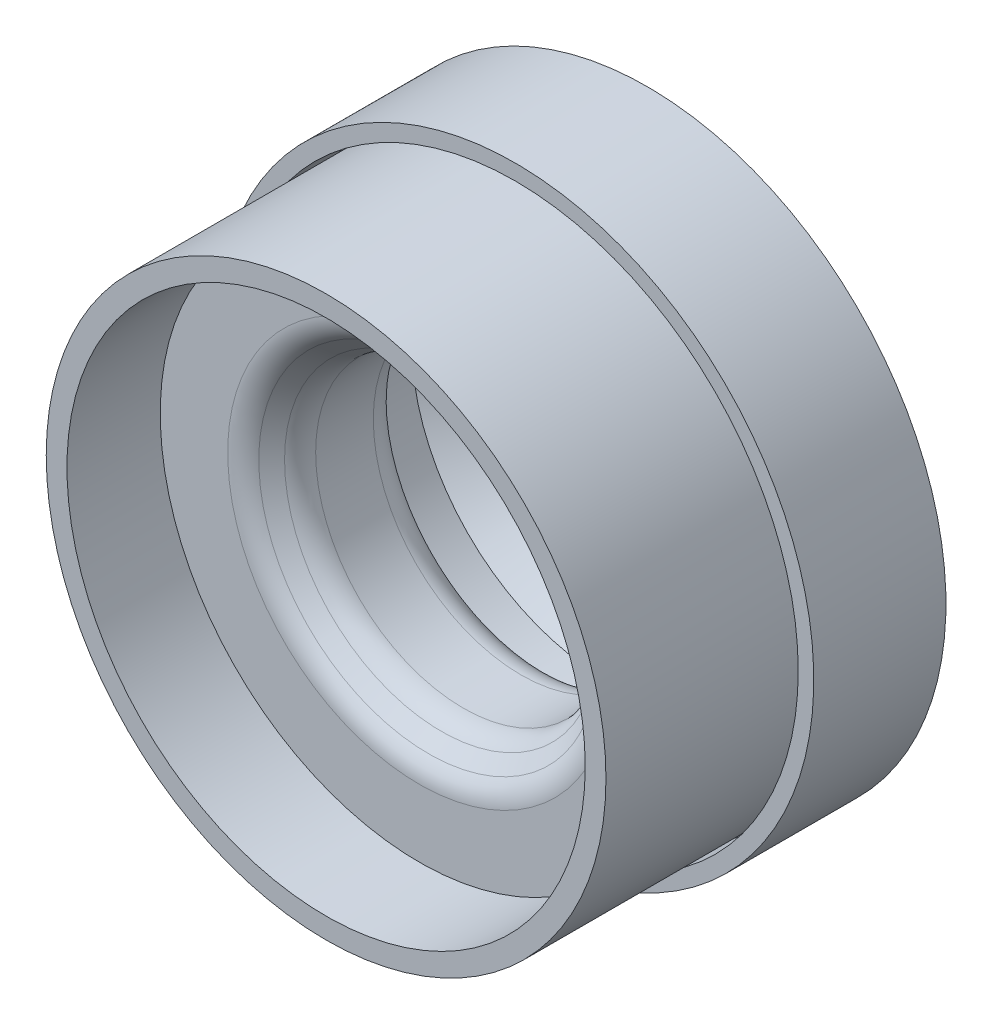
ISO-10303-21;
HEADER;
FILE_DESCRIPTION(('STEP AP214'),'2;1');
FILE_NAME('part.step','',(''),(''),'','','');
FILE_SCHEMA(('AUTOMOTIVE_DESIGN { 1 0 10303 214 1 1 1 1 }'));
ENDSEC;
DATA;
#1=APPLICATION_CONTEXT('core data for automotive mechanical design processes');
#2=APPLICATION_PROTOCOL_DEFINITION('international standard','automotive_design',2000,#1);
#3=PRODUCT_CONTEXT('',#1,'mechanical');
#4=PRODUCT('Part','Part','',(#3));
#5=PRODUCT_RELATED_PRODUCT_CATEGORY('part','',(#4));
#6=PRODUCT_DEFINITION_FORMATION('','',#4);
#7=PRODUCT_DEFINITION_CONTEXT('part definition',#1,'design');
#8=PRODUCT_DEFINITION('design','',#6,#7);
#9=PRODUCT_DEFINITION_SHAPE('','',#8);
#10=(LENGTH_UNIT() NAMED_UNIT(*) SI_UNIT(.MILLI.,.METRE.));
#11=(NAMED_UNIT(*) PLANE_ANGLE_UNIT() SI_UNIT($,.RADIAN.));
#12=(NAMED_UNIT(*) SI_UNIT($,.STERADIAN.) SOLID_ANGLE_UNIT());
#13=UNCERTAINTY_MEASURE_WITH_UNIT(LENGTH_MEASURE(1.E-05),#10,'distance_accuracy_value','');
#14=(GEOMETRIC_REPRESENTATION_CONTEXT(3) GLOBAL_UNCERTAINTY_ASSIGNED_CONTEXT((#13)) GLOBAL_UNIT_ASSIGNED_CONTEXT((#10,
#11,#12)) REPRESENTATION_CONTEXT('',''));
#15=CARTESIAN_POINT('',(0.,0.,0.));
#16=DIRECTION('',(0.,0.,1.));
#17=DIRECTION('',(1.,0.,0.));
#18=AXIS2_PLACEMENT_3D('',#15,#16,#17);
#19=CARTESIAN_POINT('',(0.,0.,-1.));
#20=DIRECTION('',(0.,0.,1.));
#21=DIRECTION('',(1.,0.,0.));
#22=AXIS2_PLACEMENT_3D('',#19,#20,#21);
#23=TOROIDAL_SURFACE('',#22,6.16421356237309,1.);
#24=CARTESIAN_POINT('',(0.,0.,-0.292893218813456));
#25=DIRECTION('',(0.,0.,1.));
#26=DIRECTION('',(1.,0.,0.));
#27=AXIS2_PLACEMENT_3D('',#24,#25,#26);
#28=CIRCLE('',#27,5.45710678118653);
#29=CARTESIAN_POINT('',(5.45710678118653,0.,-0.292893218813456));
#30=VERTEX_POINT('',#29);
#31=EDGE_CURVE('E99',#30,#30,#28,.F.);
#32=ORIENTED_EDGE('',*,*,#31,.T.);
#33=EDGE_LOOP('',(#32));
#34=FACE_BOUND('',#33,.T.);
#35=CARTESIAN_POINT('',(0.,0.,0.));
#36=DIRECTION('',(0.,0.,1.));
#37=DIRECTION('',(1.,0.,0.));
#38=AXIS2_PLACEMENT_3D('',#35,#36,#37);
#39=CIRCLE('',#38,6.16421356237309);
#40=CARTESIAN_POINT('',(6.16421356237309,0.,0.));
#41=VERTEX_POINT('',#40);
#42=EDGE_CURVE('E64',#41,#41,#39,.T.);
#43=ORIENTED_EDGE('',*,*,#42,.T.);
#44=EDGE_LOOP('',(#43));
#45=FACE_BOUND('',#44,.T.);
#46=ADVANCED_FACE('F50',(#34,#45),#23,.T.);
#47=CARTESIAN_POINT('',(0.,0.,0.));
#48=DIRECTION('',(0.,0.,1.));
#49=DIRECTION('',(1.,0.,0.));
#50=AXIS2_PLACEMENT_3D('',#47,#48,#49);
#51=PLANE('',#50);
#52=ORIENTED_EDGE('',*,*,#42,.F.);
#53=EDGE_LOOP('',(#52));
#54=FACE_BOUND('',#53,.T.);
#55=CARTESIAN_POINT('',(0.,0.,0.));
#56=DIRECTION('',(0.,0.,1.));
#57=DIRECTION('',(1.,0.,0.));
#58=AXIS2_PLACEMENT_3D('',#55,#56,#57);
#59=CIRCLE('',#58,8.33333333333334);
#60=CARTESIAN_POINT('',(8.33333333333334,0.,0.));
#61=VERTEX_POINT('',#60);
#62=EDGE_CURVE('E71',#61,#61,#59,.T.);
#63=ORIENTED_EDGE('',*,*,#62,.T.);
#64=EDGE_LOOP('',(#63));
#65=FACE_BOUND('',#64,.T.);
#66=ADVANCED_FACE('F112',(#54,#65),#51,.T.);
#67=CARTESIAN_POINT('',(0.,0.,1.));
#68=DIRECTION('',(0.,0.,-1.));
#69=DIRECTION('',(-1.,0.,0.));
#70=AXIS2_PLACEMENT_3D('',#67,#68,#69);
#71=CYLINDRICAL_SURFACE('',#70,8.33333333333334);
#72=CARTESIAN_POINT('',(0.,0.,3.));
#73=DIRECTION('',(0.,0.,1.));
#74=DIRECTION('',(1.,0.,0.));
#75=AXIS2_PLACEMENT_3D('',#72,#73,#74);
#76=CIRCLE('',#75,8.33333333333334);
#77=CARTESIAN_POINT('',(8.33333333333334,0.,3.));
#78=VERTEX_POINT('',#77);
#79=EDGE_CURVE('E67',#78,#78,#76,.T.);
#80=ORIENTED_EDGE('',*,*,#79,.T.);
#81=EDGE_LOOP('',(#80));
#82=FACE_BOUND('',#81,.T.);
#83=ORIENTED_EDGE('',*,*,#62,.F.);
#84=EDGE_LOOP('',(#83));
#85=FACE_BOUND('',#84,.T.);
#86=ADVANCED_FACE('F114',(#82,#85),#71,.F.);
#87=CARTESIAN_POINT('',(0.,0.,3.));
#88=DIRECTION('',(0.,0.,1.));
#89=DIRECTION('',(1.,0.,0.));
#90=AXIS2_PLACEMENT_3D('',#87,#88,#89);
#91=PLANE('',#90);
#92=ORIENTED_EDGE('',*,*,#79,.F.);
#93=EDGE_LOOP('',(#92));
#94=FACE_BOUND('',#93,.T.);
#95=CARTESIAN_POINT('',(0.,0.,3.));
#96=DIRECTION('',(0.,0.,1.));
#97=DIRECTION('',(1.,0.,0.));
#98=AXIS2_PLACEMENT_3D('',#95,#96,#97);
#99=CIRCLE('',#98,9.);
#100=CARTESIAN_POINT('',(9.,0.,3.));
#101=VERTEX_POINT('',#100);
#102=EDGE_CURVE('E54',#101,#101,#99,.T.);
#103=ORIENTED_EDGE('',*,*,#102,.T.);
#104=EDGE_LOOP('',(#103));
#105=FACE_BOUND('',#104,.T.);
#106=ADVANCED_FACE('F52',(#94,#105),#91,.T.);
#107=CARTESIAN_POINT('',(0.,0.,-7.33333333333333));
#108=DIRECTION('',(0.,0.,1.));
#109=DIRECTION('',(1.,0.,0.));
#110=AXIS2_PLACEMENT_3D('',#107,#108,#109);
#111=CYLINDRICAL_SURFACE('',#110,9.);
#112=CARTESIAN_POINT('',(0.,0.,-4.71132486540518));
#113=DIRECTION('',(0.,0.,1.));
#114=DIRECTION('',(1.,0.,0.));
#115=AXIS2_PLACEMENT_3D('',#112,#113,#114);
#116=CIRCLE('',#115,9.);
#117=CARTESIAN_POINT('',(9.,0.,-4.71132486540518));
#118=VERTEX_POINT('',#117);
#119=EDGE_CURVE('E12',#118,#118,#116,.F.);
#120=ORIENTED_EDGE('',*,*,#119,.F.);
#121=EDGE_LOOP('',(#120));
#122=FACE_BOUND('',#121,.T.);
#123=ORIENTED_EDGE('',*,*,#102,.F.);
#124=EDGE_LOOP('',(#123));
#125=FACE_BOUND('',#124,.T.);
#126=ADVANCED_FACE('F154',(#122,#125),#111,.T.);
#127=CARTESIAN_POINT('',(0.,0.,-1.));
#128=DIRECTION('',(0.,0.,1.));
#129=DIRECTION('',(1.,0.,0.));
#130=AXIS2_PLACEMENT_3D('',#127,#128,#129);
#131=CONICAL_SURFACE('',#130,4.75,0.785398163397442);
#132=CARTESIAN_POINT('',(0.,0.,-0.707106781186551));
#133=DIRECTION('',(0.,0.,1.));
#134=DIRECTION('',(1.,0.,0.));
#135=AXIS2_PLACEMENT_3D('',#132,#133,#134);
#136=CIRCLE('',#135,5.04289321881344);
#137=CARTESIAN_POINT('',(5.04289321881344,0.,-0.707106781186551));
#138=VERTEX_POINT('',#137);
#139=EDGE_CURVE('E102',#138,#138,#136,.T.);
#140=ORIENTED_EDGE('',*,*,#139,.F.);
#141=EDGE_LOOP('',(#140));
#142=FACE_BOUND('',#141,.T.);
#143=ORIENTED_EDGE('',*,*,#31,.F.);
#144=EDGE_LOOP('',(#143));
#145=FACE_BOUND('',#144,.T.);
#146=ADVANCED_FACE('F150',(#142,#145),#131,.F.);
#147=CARTESIAN_POINT('',(0.,0.,-1.41421356237309));
#148=DIRECTION('',(0.,0.,-1.));
#149=DIRECTION('',(-1.,0.,0.));
#150=AXIS2_PLACEMENT_3D('',#147,#148,#149);
#151=TOROIDAL_SURFACE('',#150,5.75,1.);
#152=ORIENTED_EDGE('',*,*,#139,.T.);
#153=EDGE_LOOP('',(#152));
#154=FACE_BOUND('',#153,.T.);
#155=CARTESIAN_POINT('',(0.,0.,-1.41421356237309));
#156=DIRECTION('',(0.,0.,-1.));
#157=DIRECTION('',(-1.,0.,0.));
#158=AXIS2_PLACEMENT_3D('',#155,#156,#157);
#159=CIRCLE('',#158,4.75);
#160=CARTESIAN_POINT('',(-4.75,0.,-1.41421356237309));
#161=VERTEX_POINT('',#160);
#162=EDGE_CURVE('E70',#161,#161,#159,.T.);
#163=ORIENTED_EDGE('',*,*,#162,.T.);
#164=EDGE_LOOP('',(#163));
#165=FACE_BOUND('',#164,.T.);
#166=ADVANCED_FACE('F152',(#154,#165),#151,.T.);
#167=CARTESIAN_POINT('',(0.,0.,-5.));
#168=DIRECTION('',(0.,0.,1.));
#169=DIRECTION('',(1.,0.,0.));
#170=AXIS2_PLACEMENT_3D('',#167,#168,#169);
#171=CYLINDRICAL_SURFACE('',#170,4.75);
#172=CARTESIAN_POINT('',(0.,0.,-3.26794919243111));
#173=DIRECTION('',(0.,0.,1.));
#174=DIRECTION('',(1.,0.,0.));
#175=AXIS2_PLACEMENT_3D('',#172,#173,#174);
#176=CIRCLE('',#175,4.75);
#177=CARTESIAN_POINT('',(4.75,0.,-3.26794919243111));
#178=VERTEX_POINT('',#177);
#179=EDGE_CURVE('E77',#178,#178,#176,.T.);
#180=ORIENTED_EDGE('',*,*,#179,.F.);
#181=EDGE_LOOP('',(#180));
#182=FACE_BOUND('',#181,.T.);
#183=ORIENTED_EDGE('',*,*,#162,.F.);
#184=EDGE_LOOP('',(#183));
#185=FACE_BOUND('',#184,.T.);
#186=ADVANCED_FACE('F140',(#182,#185),#171,.F.);
#187=CARTESIAN_POINT('',(0.,0.,-3.26794919243111));
#188=DIRECTION('',(0.,0.,1.));
#189=DIRECTION('',(1.,0.,0.));
#190=AXIS2_PLACEMENT_3D('',#187,#188,#189);
#191=TOROIDAL_SURFACE('',#190,5.75,1.);
#192=CARTESIAN_POINT('',(0.,0.,-4.13397459621554));
#193=DIRECTION('',(0.,0.,-1.));
#194=DIRECTION('',(-1.,0.,0.));
#195=AXIS2_PLACEMENT_3D('',#192,#193,#194);
#196=CIRCLE('',#195,5.24999999999999);
#197=CARTESIAN_POINT('',(-5.24999999999999,0.,-4.13397459621554));
#198=VERTEX_POINT('',#197);
#199=EDGE_CURVE('E95',#198,#198,#196,.T.);
#200=ORIENTED_EDGE('',*,*,#199,.T.);
#201=EDGE_LOOP('',(#200));
#202=FACE_BOUND('',#201,.T.);
#203=ORIENTED_EDGE('',*,*,#179,.T.);
#204=EDGE_LOOP('',(#203));
#205=FACE_BOUND('',#204,.T.);
#206=ADVANCED_FACE('F129',(#202,#205),#191,.T.);
#207=CARTESIAN_POINT('',(0.,0.,-5.));
#208=DIRECTION('',(0.,0.,-1.));
#209=DIRECTION('',(-1.,0.,0.));
#210=AXIS2_PLACEMENT_3D('',#207,#208,#209);
#211=CONICAL_SURFACE('',#210,6.75000000000001,1.04719755119659);
#212=ORIENTED_EDGE('',*,*,#199,.F.);
#213=EDGE_LOOP('',(#212));
#214=FACE_BOUND('',#213,.T.);
#215=CARTESIAN_POINT('',(0.,0.,-4.71132486540518));
#216=DIRECTION('',(0.,0.,-1.));
#217=DIRECTION('',(-1.,0.,0.));
#218=AXIS2_PLACEMENT_3D('',#215,#216,#217);
#219=CIRCLE('',#218,6.25);
#220=CARTESIAN_POINT('',(-6.25,0.,-4.71132486540518));
#221=VERTEX_POINT('',#220);
#222=EDGE_CURVE('E358',#221,#221,#219,.T.);
#223=ORIENTED_EDGE('',*,*,#222,.T.);
#224=EDGE_LOOP('',(#223));
#225=FACE_BOUND('',#224,.T.);
#226=ADVANCED_FACE('F127',(#214,#225),#211,.F.);
#227=CARTESIAN_POINT('',(0.,0.,-4.71132486540518));
#228=DIRECTION('',(0.,0.,1.));
#229=DIRECTION('',(1.,0.,0.));
#230=AXIS2_PLACEMENT_3D('',#227,#228,#229);
#231=PLANE('',#230);
#232=ORIENTED_EDGE('',*,*,#119,.T.);
#233=EDGE_LOOP('',(#232));
#234=FACE_BOUND('',#233,.T.);
#235=CARTESIAN_POINT('',(0.,0.,-4.71132486540518));
#236=DIRECTION('',(0.,0.,1.));
#237=DIRECTION('',(1.,0.,0.));
#238=AXIS2_PLACEMENT_3D('',#235,#236,#237);
#239=CIRCLE('',#238,9.1);
#240=CARTESIAN_POINT('',(9.1,0.,-4.71132486540518));
#241=VERTEX_POINT('',#240);
#242=EDGE_CURVE('E89',#241,#241,#239,.F.);
#243=ORIENTED_EDGE('',*,*,#242,.F.);
#244=EDGE_LOOP('',(#243));
#245=FACE_BOUND('',#244,.T.);
#246=ADVANCED_FACE('F125',(#234,#245),#231,.T.);
#247=CARTESIAN_POINT('',(0.,0.,-7.));
#248=DIRECTION('',(0.,0.,-1.));
#249=DIRECTION('',(-1.,0.,0.));
#250=AXIS2_PLACEMENT_3D('',#247,#248,#249);
#251=PLANE('',#250);
#252=CARTESIAN_POINT('',(0.,0.,-7.));
#253=DIRECTION('',(0.,0.,-1.));
#254=DIRECTION('',(-1.,0.,0.));
#255=AXIS2_PLACEMENT_3D('',#252,#253,#254);
#256=CIRCLE('',#255,5.25);
#257=CARTESIAN_POINT('',(-5.25,0.,-7.));
#258=VERTEX_POINT('',#257);
#259=EDGE_CURVE('E80',#258,#258,#256,.T.);
#260=ORIENTED_EDGE('',*,*,#259,.F.);
#261=EDGE_LOOP('',(#260));
#262=FACE_BOUND('',#261,.T.);
#263=ADVANCED_FACE('F137',(#262),#251,.F.);
#264=CARTESIAN_POINT('',(0.,0.,-7.));
#265=DIRECTION('',(0.,0.,1.));
#266=DIRECTION('',(1.,0.,0.));
#267=AXIS2_PLACEMENT_3D('',#264,#265,#266);
#268=CONICAL_SURFACE('',#267,5.25,0.785398163397448);
#269=CARTESIAN_POINT('',(0.,0.,-6.));
#270=DIRECTION('',(0.,0.,-1.));
#271=DIRECTION('',(-1.,0.,0.));
#272=AXIS2_PLACEMENT_3D('',#269,#270,#271);
#273=CIRCLE('',#272,6.25);
#274=CARTESIAN_POINT('',(-6.25,0.,-6.));
#275=VERTEX_POINT('',#274);
#276=EDGE_CURVE('E86',#275,#275,#273,.F.);
#277=ORIENTED_EDGE('',*,*,#276,.T.);
#278=EDGE_LOOP('',(#277));
#279=FACE_BOUND('',#278,.T.);
#280=ORIENTED_EDGE('',*,*,#259,.T.);
#281=EDGE_LOOP('',(#280));
#282=FACE_BOUND('',#281,.T.);
#283=ADVANCED_FACE('F177',(#279,#282),#268,.F.);
#284=CARTESIAN_POINT('',(0.,0.,-7.));
#285=DIRECTION('',(0.,0.,1.));
#286=DIRECTION('',(1.,0.,0.));
#287=AXIS2_PLACEMENT_3D('',#284,#285,#286);
#288=CYLINDRICAL_SURFACE('',#287,6.25);
#289=ORIENTED_EDGE('',*,*,#276,.F.);
#290=EDGE_LOOP('',(#289));
#291=FACE_BOUND('',#290,.T.);
#292=ORIENTED_EDGE('',*,*,#222,.F.);
#293=EDGE_LOOP('',(#292));
#294=FACE_BOUND('',#293,.T.);
#295=ADVANCED_FACE('F171',(#291,#294),#288,.F.);
#296=CARTESIAN_POINT('',(0.,0.,-3.08333333333333));
#297=DIRECTION('',(0.,0.,-1.));
#298=DIRECTION('',(-1.,0.,0.));
#299=AXIS2_PLACEMENT_3D('',#296,#297,#298);
#300=CYLINDRICAL_SURFACE('',#299,9.6);
#301=CARTESIAN_POINT('',(0.,0.,-3.08333333333333));
#302=DIRECTION('',(0.,0.,-1.));
#303=DIRECTION('',(-1.,0.,0.));
#304=AXIS2_PLACEMENT_3D('',#301,#302,#303);
#305=CIRCLE('',#304,9.6);
#306=CARTESIAN_POINT('',(-9.6,0.,-3.08333333333333));
#307=VERTEX_POINT('',#306);
#308=EDGE_CURVE('E349',#307,#307,#305,.T.);
#309=ORIENTED_EDGE('',*,*,#308,.T.);
#310=EDGE_LOOP('',(#309));
#311=FACE_BOUND('',#310,.T.);
#312=CARTESIAN_POINT('',(0.,0.,-7.33333333333333));
#313=DIRECTION('',(0.,0.,-1.));
#314=DIRECTION('',(-1.,0.,0.));
#315=AXIS2_PLACEMENT_3D('',#312,#313,#314);
#316=CIRCLE('',#315,9.6);
#317=CARTESIAN_POINT('',(-9.6,0.,-7.33333333333333));
#318=VERTEX_POINT('',#317);
#319=EDGE_CURVE('E352',#318,#318,#316,.T.);
#320=ORIENTED_EDGE('',*,*,#319,.F.);
#321=EDGE_LOOP('',(#320));
#322=FACE_BOUND('',#321,.T.);
#323=ADVANCED_FACE('F176',(#311,#322),#300,.T.);
#324=CARTESIAN_POINT('',(0.,0.,-3.08333333333333));
#325=DIRECTION('',(0.,0.,-1.));
#326=DIRECTION('',(-1.,0.,0.));
#327=AXIS2_PLACEMENT_3D('',#324,#325,#326);
#328=PLANE('',#327);
#329=CARTESIAN_POINT('',(0.,0.,-3.08333333333333));
#330=DIRECTION('',(0.,0.,-1.));
#331=DIRECTION('',(-1.,0.,0.));
#332=AXIS2_PLACEMENT_3D('',#329,#330,#331);
#333=CIRCLE('',#332,9.1);
#334=CARTESIAN_POINT('',(-9.1,0.,-3.08333333333333));
#335=VERTEX_POINT('',#334);
#336=EDGE_CURVE('E354',#335,#335,#333,.T.);
#337=ORIENTED_EDGE('',*,*,#336,.T.);
#338=EDGE_LOOP('',(#337));
#339=FACE_BOUND('',#338,.T.);
#340=ORIENTED_EDGE('',*,*,#308,.F.);
#341=EDGE_LOOP('',(#340));
#342=FACE_BOUND('',#341,.T.);
#343=ADVANCED_FACE('F276',(#339,#342),#328,.F.);
#344=CARTESIAN_POINT('',(0.,0.,-3.08333333333333));
#345=DIRECTION('',(0.,0.,-1.));
#346=DIRECTION('',(-1.,0.,0.));
#347=AXIS2_PLACEMENT_3D('',#344,#345,#346);
#348=CYLINDRICAL_SURFACE('',#347,9.1);
#349=ORIENTED_EDGE('',*,*,#242,.T.);
#350=EDGE_LOOP('',(#349));
#351=FACE_BOUND('',#350,.T.);
#352=ORIENTED_EDGE('',*,*,#336,.F.);
#353=EDGE_LOOP('',(#352));
#354=FACE_BOUND('',#353,.T.);
#355=ADVANCED_FACE('F265',(#351,#354),#348,.F.);
#356=CARTESIAN_POINT('',(0.,0.,-7.33333333333333));
#357=DIRECTION('',(0.,0.,1.));
#358=DIRECTION('',(1.,0.,0.));
#359=AXIS2_PLACEMENT_3D('',#356,#357,#358);
#360=PLANE('',#359);
#361=ORIENTED_EDGE('',*,*,#319,.T.);
#362=EDGE_LOOP('',(#361));
#363=FACE_BOUND('',#362,.T.);
#364=ADVANCED_FACE('F260',(#363),#360,.F.);
#365=CLOSED_SHELL('',(#46,#66,#86,#106,#126,#146,#166,#186,#206,#226,#246,#263,#283,#295,#323,
#343,#355,#364));
#366=MANIFOLD_SOLID_BREP('B2',#365);
#367=ADVANCED_BREP_SHAPE_REPRESENTATION('',(#18,#366),#14);
#368=SHAPE_DEFINITION_REPRESENTATION(#9,#367);
ENDSEC;
END-ISO-10303-21;
